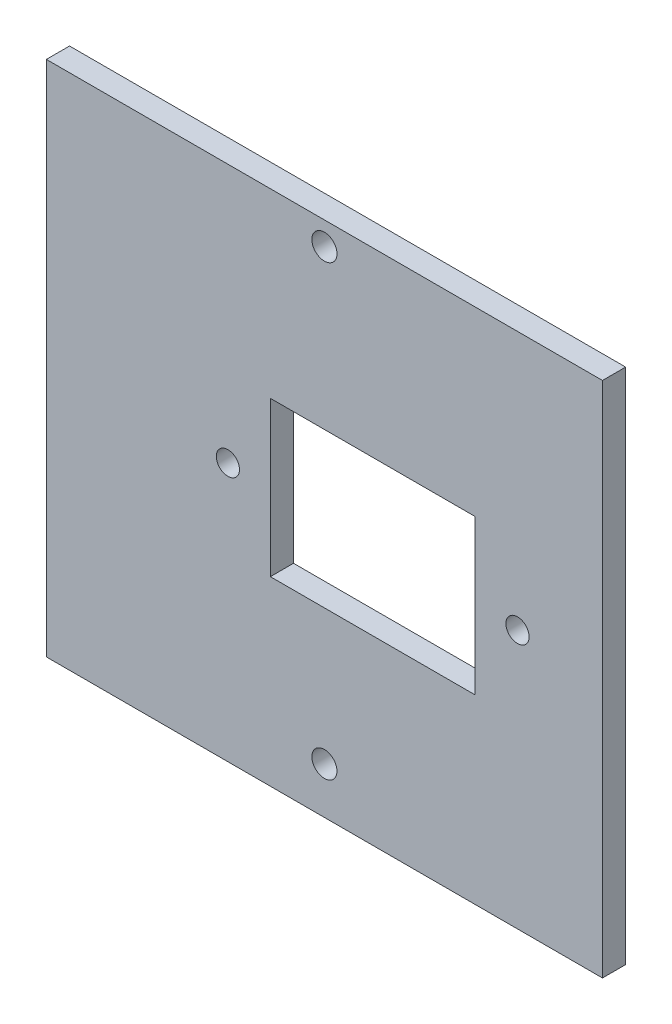
ISO-10303-21;
HEADER;
FILE_DESCRIPTION(('STEP AP214'),'2;1');
FILE_NAME('part.step','',(''),(''),'','','');
FILE_SCHEMA(('AUTOMOTIVE_DESIGN { 1 0 10303 214 1 1 1 1 }'));
ENDSEC;
DATA;
#1=APPLICATION_CONTEXT('core data for automotive mechanical design processes');
#2=APPLICATION_PROTOCOL_DEFINITION('international standard','automotive_design',2000,#1);
#3=PRODUCT_CONTEXT('',#1,'mechanical');
#4=PRODUCT('Part','Part','',(#3));
#5=PRODUCT_RELATED_PRODUCT_CATEGORY('part','',(#4));
#6=PRODUCT_DEFINITION_FORMATION('','',#4);
#7=PRODUCT_DEFINITION_CONTEXT('part definition',#1,'design');
#8=PRODUCT_DEFINITION('design','',#6,#7);
#9=PRODUCT_DEFINITION_SHAPE('','',#8);
#10=(LENGTH_UNIT() NAMED_UNIT(*) SI_UNIT(.MILLI.,.METRE.));
#11=(NAMED_UNIT(*) PLANE_ANGLE_UNIT() SI_UNIT($,.RADIAN.));
#12=(NAMED_UNIT(*) SI_UNIT($,.STERADIAN.) SOLID_ANGLE_UNIT());
#13=UNCERTAINTY_MEASURE_WITH_UNIT(LENGTH_MEASURE(1.E-05),#10,'distance_accuracy_value','');
#14=(GEOMETRIC_REPRESENTATION_CONTEXT(3) GLOBAL_UNCERTAINTY_ASSIGNED_CONTEXT((#13)) GLOBAL_UNIT_ASSIGNED_CONTEXT((#10,
#11,#12)) REPRESENTATION_CONTEXT('',''));
#15=CARTESIAN_POINT('',(0.,0.,0.));
#16=DIRECTION('',(0.,0.,1.));
#17=DIRECTION('',(1.,0.,0.));
#18=AXIS2_PLACEMENT_3D('',#15,#16,#17);
#19=CARTESIAN_POINT('',(119.049688552672,-53.1399541066378,3.));
#20=DIRECTION('',(-1.,0.,0.));
#21=DIRECTION('',(0.,0.,1.));
#22=AXIS2_PLACEMENT_3D('',#19,#20,#21);
#23=PLANE('',#22);
#24=DIRECTION('',(0.,1.,0.));
#25=VECTOR('',#24,1.);
#26=CARTESIAN_POINT('',(119.049688552672,-53.1399541066378,0.));
#27=LINE('',#26,#25);
#28=CARTESIAN_POINT('',(119.049688552672,-53.1399541066378,0.));
#29=VERTEX_POINT('',#28);
#30=CARTESIAN_POINT('',(119.049688552672,13.8600458933622,0.));
#31=VERTEX_POINT('',#30);
#32=EDGE_CURVE('E142',#29,#31,#27,.T.);
#33=ORIENTED_EDGE('',*,*,#32,.T.);
#34=DIRECTION('',(0.,0.,-1.));
#35=VECTOR('',#34,1.);
#36=CARTESIAN_POINT('',(119.049688552672,13.8600458933622,3.));
#37=LINE('',#36,#35);
#38=CARTESIAN_POINT('',(119.049688552672,13.8600458933622,3.));
#39=VERTEX_POINT('',#38);
#40=EDGE_CURVE('E11',#39,#31,#37,.T.);
#41=ORIENTED_EDGE('',*,*,#40,.F.);
#42=DIRECTION('',(0.,1.,0.));
#43=VECTOR('',#42,1.);
#44=CARTESIAN_POINT('',(119.049688552672,-53.1399541066378,3.));
#45=LINE('',#44,#43);
#46=CARTESIAN_POINT('',(119.049688552672,-53.1399541066378,3.));
#47=VERTEX_POINT('',#46);
#48=EDGE_CURVE('E146',#47,#39,#45,.T.);
#49=ORIENTED_EDGE('',*,*,#48,.F.);
#50=DIRECTION('',(0.,0.,-1.));
#51=VECTOR('',#50,1.);
#52=CARTESIAN_POINT('',(119.049688552672,-53.1399541066378,3.));
#53=LINE('',#52,#51);
#54=EDGE_CURVE('E156',#47,#29,#53,.T.);
#55=ORIENTED_EDGE('',*,*,#54,.T.);
#56=EDGE_LOOP('',(#33,#41,#49,#55));
#57=FACE_BOUND('',#56,.T.);
#58=ADVANCED_FACE('F41',(#57),#23,.F.);
#59=CARTESIAN_POINT('',(47.0496885526717,13.8600458933622,3.));
#60=DIRECTION('',(0.,-1.,0.));
#61=DIRECTION('',(0.,0.,-1.));
#62=AXIS2_PLACEMENT_3D('',#59,#60,#61);
#63=PLANE('',#62);
#64=DIRECTION('',(-1.,0.,0.));
#65=VECTOR('',#64,1.);
#66=CARTESIAN_POINT('',(47.0496885526717,13.8600458933622,0.));
#67=LINE('',#66,#65);
#68=CARTESIAN_POINT('',(47.0496885526717,13.8600458933622,0.));
#69=VERTEX_POINT('',#68);
#70=EDGE_CURVE('E159',#31,#69,#67,.T.);
#71=ORIENTED_EDGE('',*,*,#70,.T.);
#72=DIRECTION('',(0.,0.,-1.));
#73=VECTOR('',#72,1.);
#74=CARTESIAN_POINT('',(47.0496885526717,13.8600458933622,3.));
#75=LINE('',#74,#73);
#76=CARTESIAN_POINT('',(47.0496885526717,13.8600458933622,3.));
#77=VERTEX_POINT('',#76);
#78=EDGE_CURVE('E48',#77,#69,#75,.T.);
#79=ORIENTED_EDGE('',*,*,#78,.F.);
#80=DIRECTION('',(-1.,0.,0.));
#81=VECTOR('',#80,1.);
#82=CARTESIAN_POINT('',(47.0496885526717,13.8600458933622,3.));
#83=LINE('',#82,#81);
#84=EDGE_CURVE('E149',#39,#77,#83,.T.);
#85=ORIENTED_EDGE('',*,*,#84,.F.);
#86=ORIENTED_EDGE('',*,*,#40,.T.);
#87=EDGE_LOOP('',(#71,#79,#85,#86));
#88=FACE_BOUND('',#87,.T.);
#89=ADVANCED_FACE('F187',(#88),#63,.F.);
#90=CARTESIAN_POINT('',(47.0496885526717,-53.1399541066378,3.));
#91=DIRECTION('',(1.,0.,0.));
#92=DIRECTION('',(0.,0.,-1.));
#93=AXIS2_PLACEMENT_3D('',#90,#91,#92);
#94=PLANE('',#93);
#95=DIRECTION('',(0.,-1.,0.));
#96=VECTOR('',#95,1.);
#97=CARTESIAN_POINT('',(47.0496885526717,-53.1399541066378,0.));
#98=LINE('',#97,#96);
#99=CARTESIAN_POINT('',(47.0496885526717,-53.1399541066378,0.));
#100=VERTEX_POINT('',#99);
#101=EDGE_CURVE('E161',#69,#100,#98,.T.);
#102=ORIENTED_EDGE('',*,*,#101,.T.);
#103=DIRECTION('',(0.,0.,-1.));
#104=VECTOR('',#103,1.);
#105=CARTESIAN_POINT('',(47.0496885526717,-53.1399541066378,3.));
#106=LINE('',#105,#104);
#107=CARTESIAN_POINT('',(47.0496885526717,-53.1399541066378,3.));
#108=VERTEX_POINT('',#107);
#109=EDGE_CURVE('E166',#108,#100,#106,.T.);
#110=ORIENTED_EDGE('',*,*,#109,.F.);
#111=DIRECTION('',(0.,-1.,0.));
#112=VECTOR('',#111,1.);
#113=CARTESIAN_POINT('',(47.0496885526717,-53.1399541066378,3.));
#114=LINE('',#113,#112);
#115=EDGE_CURVE('E152',#77,#108,#114,.T.);
#116=ORIENTED_EDGE('',*,*,#115,.F.);
#117=ORIENTED_EDGE('',*,*,#78,.T.);
#118=EDGE_LOOP('',(#102,#110,#116,#117));
#119=FACE_BOUND('',#118,.T.);
#120=ADVANCED_FACE('F173',(#119),#94,.F.);
#121=CARTESIAN_POINT('',(47.0496885526717,-53.1399541066378,3.));
#122=DIRECTION('',(0.,1.,0.));
#123=DIRECTION('',(0.,0.,1.));
#124=AXIS2_PLACEMENT_3D('',#121,#122,#123);
#125=PLANE('',#124);
#126=DIRECTION('',(1.,0.,0.));
#127=VECTOR('',#126,1.);
#128=CARTESIAN_POINT('',(47.0496885526717,-53.1399541066378,0.));
#129=LINE('',#128,#127);
#130=EDGE_CURVE('E150',#100,#29,#129,.T.);
#131=ORIENTED_EDGE('',*,*,#130,.T.);
#132=ORIENTED_EDGE('',*,*,#54,.F.);
#133=DIRECTION('',(1.,0.,0.));
#134=VECTOR('',#133,1.);
#135=CARTESIAN_POINT('',(47.0496885526717,-53.1399541066378,3.));
#136=LINE('',#135,#134);
#137=EDGE_CURVE('E154',#108,#47,#136,.T.);
#138=ORIENTED_EDGE('',*,*,#137,.F.);
#139=ORIENTED_EDGE('',*,*,#109,.T.);
#140=EDGE_LOOP('',(#131,#132,#138,#139));
#141=FACE_BOUND('',#140,.T.);
#142=ADVANCED_FACE('F182',(#141),#125,.F.);
#143=CARTESIAN_POINT('',(0.,0.,3.));
#144=DIRECTION('',(0.,0.,-1.));
#145=DIRECTION('',(-1.,0.,0.));
#146=AXIS2_PLACEMENT_3D('',#143,#144,#145);
#147=PLANE('',#146);
#148=CARTESIAN_POINT('',(83.049688552666,-47.1399541066383,3.));
#149=DIRECTION('',(0.,0.,-1.));
#150=DIRECTION('',(-1.,0.,0.));
#151=AXIS2_PLACEMENT_3D('',#148,#149,#150);
#152=CIRCLE('',#151,1.62499999999696);
#153=CARTESIAN_POINT('',(81.424688552669,-47.1399541066383,3.));
#154=VERTEX_POINT('',#153);
#155=EDGE_CURVE('E136',#154,#154,#152,.T.);
#156=ORIENTED_EDGE('',*,*,#155,.T.);
#157=EDGE_LOOP('',(#156));
#158=FACE_BOUND('',#157,.T.);
#159=CARTESIAN_POINT('',(83.049688552666,10.8600458933622,3.));
#160=DIRECTION('',(0.,0.,-1.));
#161=DIRECTION('',(-1.,0.,0.));
#162=AXIS2_PLACEMENT_3D('',#159,#160,#161);
#163=CIRCLE('',#162,1.62499999999459);
#164=CARTESIAN_POINT('',(81.4246885526714,10.8600458933622,3.));
#165=VERTEX_POINT('',#164);
#166=EDGE_CURVE('E252',#165,#165,#163,.T.);
#167=ORIENTED_EDGE('',*,*,#166,.T.);
#168=EDGE_LOOP('',(#167));
#169=FACE_BOUND('',#168,.T.);
#170=CARTESIAN_POINT('',(108.049688552672,-19.6399541066379,3.));
#171=DIRECTION('',(0.,0.,-1.));
#172=DIRECTION('',(-1.,0.,0.));
#173=AXIS2_PLACEMENT_3D('',#170,#171,#172);
#174=CIRCLE('',#173,1.5);
#175=CARTESIAN_POINT('',(106.549688552672,-19.6399541066379,3.));
#176=VERTEX_POINT('',#175);
#177=EDGE_CURVE('E234',#176,#176,#174,.T.);
#178=ORIENTED_EDGE('',*,*,#177,.T.);
#179=EDGE_LOOP('',(#178));
#180=FACE_BOUND('',#179,.T.);
#181=CARTESIAN_POINT('',(70.5496885526717,-19.6399541066379,3.));
#182=DIRECTION('',(0.,0.,-1.));
#183=DIRECTION('',(-1.,0.,0.));
#184=AXIS2_PLACEMENT_3D('',#181,#182,#183);
#185=CIRCLE('',#184,1.5);
#186=CARTESIAN_POINT('',(69.0496885526717,-19.6399541066379,3.));
#187=VERTEX_POINT('',#186);
#188=EDGE_CURVE('E239',#187,#187,#185,.T.);
#189=ORIENTED_EDGE('',*,*,#188,.T.);
#190=EDGE_LOOP('',(#189));
#191=FACE_BOUND('',#190,.T.);
#192=DIRECTION('',(0.,1.,0.));
#193=VECTOR('',#192,1.);
#194=CARTESIAN_POINT('',(76.0496885526717,-9.63995410663785,3.));
#195=LINE('',#194,#193);
#196=CARTESIAN_POINT('',(76.0496885526717,-29.6399541066378,3.));
#197=VERTEX_POINT('',#196);
#198=CARTESIAN_POINT('',(76.0496885526717,-9.63995410663785,3.));
#199=VERTEX_POINT('',#198);
#200=EDGE_CURVE('E113',#197,#199,#195,.T.);
#201=ORIENTED_EDGE('',*,*,#200,.T.);
#202=DIRECTION('',(1.,0.,0.));
#203=VECTOR('',#202,1.);
#204=CARTESIAN_POINT('',(102.549688552672,-9.63995410663785,3.));
#205=LINE('',#204,#203);
#206=CARTESIAN_POINT('',(102.549688552672,-9.63995410663785,3.));
#207=VERTEX_POINT('',#206);
#208=EDGE_CURVE('E107',#199,#207,#205,.T.);
#209=ORIENTED_EDGE('',*,*,#208,.T.);
#210=DIRECTION('',(0.,-1.,0.));
#211=VECTOR('',#210,1.);
#212=CARTESIAN_POINT('',(102.549688552672,-9.63995410663785,3.));
#213=LINE('',#212,#211);
#214=CARTESIAN_POINT('',(102.549688552672,-29.6399541066379,3.));
#215=VERTEX_POINT('',#214);
#216=EDGE_CURVE('E116',#207,#215,#213,.T.);
#217=ORIENTED_EDGE('',*,*,#216,.T.);
#218=DIRECTION('',(-1.,0.,0.));
#219=VECTOR('',#218,1.);
#220=CARTESIAN_POINT('',(76.0496885526717,-29.6399541066378,3.));
#221=LINE('',#220,#219);
#222=EDGE_CURVE('E55',#215,#197,#221,.T.);
#223=ORIENTED_EDGE('',*,*,#222,.T.);
#224=EDGE_LOOP('',(#201,#209,#217,#223));
#225=FACE_BOUND('',#224,.T.);
#226=ORIENTED_EDGE('',*,*,#48,.T.);
#227=ORIENTED_EDGE('',*,*,#84,.T.);
#228=ORIENTED_EDGE('',*,*,#115,.T.);
#229=ORIENTED_EDGE('',*,*,#137,.T.);
#230=EDGE_LOOP('',(#226,#227,#228,#229));
#231=FACE_BOUND('',#230,.T.);
#232=ADVANCED_FACE('F120',(#158,#169,#180,#191,#225,#231),#147,.F.);
#233=CARTESIAN_POINT('',(0.,0.,0.));
#234=DIRECTION('',(0.,0.,-1.));
#235=DIRECTION('',(-1.,0.,0.));
#236=AXIS2_PLACEMENT_3D('',#233,#234,#235);
#237=PLANE('',#236);
#238=CARTESIAN_POINT('',(83.049688552666,-47.1399541066383,0.));
#239=DIRECTION('',(0.,0.,-1.));
#240=DIRECTION('',(-1.,0.,0.));
#241=AXIS2_PLACEMENT_3D('',#238,#239,#240);
#242=CIRCLE('',#241,1.62499999999696);
#243=CARTESIAN_POINT('',(81.424688552669,-47.1399541066383,0.));
#244=VERTEX_POINT('',#243);
#245=EDGE_CURVE('E250',#244,#244,#242,.T.);
#246=ORIENTED_EDGE('',*,*,#245,.F.);
#247=EDGE_LOOP('',(#246));
#248=FACE_BOUND('',#247,.T.);
#249=CARTESIAN_POINT('',(83.049688552666,10.8600458933622,0.));
#250=DIRECTION('',(0.,0.,-1.));
#251=DIRECTION('',(-1.,0.,0.));
#252=AXIS2_PLACEMENT_3D('',#249,#250,#251);
#253=CIRCLE('',#252,1.62499999999459);
#254=CARTESIAN_POINT('',(81.4246885526714,10.8600458933622,0.));
#255=VERTEX_POINT('',#254);
#256=EDGE_CURVE('E129',#255,#255,#253,.T.);
#257=ORIENTED_EDGE('',*,*,#256,.F.);
#258=EDGE_LOOP('',(#257));
#259=FACE_BOUND('',#258,.T.);
#260=CARTESIAN_POINT('',(108.049688552672,-19.6399541066379,0.));
#261=DIRECTION('',(0.,0.,-1.));
#262=DIRECTION('',(-1.,0.,0.));
#263=AXIS2_PLACEMENT_3D('',#260,#261,#262);
#264=CIRCLE('',#263,1.5);
#265=CARTESIAN_POINT('',(106.549688552672,-19.6399541066379,0.));
#266=VERTEX_POINT('',#265);
#267=EDGE_CURVE('E237',#266,#266,#264,.T.);
#268=ORIENTED_EDGE('',*,*,#267,.F.);
#269=EDGE_LOOP('',(#268));
#270=FACE_BOUND('',#269,.T.);
#271=CARTESIAN_POINT('',(70.5496885526717,-19.6399541066379,0.));
#272=DIRECTION('',(0.,0.,-1.));
#273=DIRECTION('',(-1.,0.,0.));
#274=AXIS2_PLACEMENT_3D('',#271,#272,#273);
#275=CIRCLE('',#274,1.5);
#276=CARTESIAN_POINT('',(69.0496885526717,-19.6399541066379,0.));
#277=VERTEX_POINT('',#276);
#278=EDGE_CURVE('E243',#277,#277,#275,.T.);
#279=ORIENTED_EDGE('',*,*,#278,.F.);
#280=EDGE_LOOP('',(#279));
#281=FACE_BOUND('',#280,.T.);
#282=DIRECTION('',(1.,0.,0.));
#283=VECTOR('',#282,1.);
#284=CARTESIAN_POINT('',(102.549688552672,-9.63995410663785,0.));
#285=LINE('',#284,#283);
#286=CARTESIAN_POINT('',(76.0496885526717,-9.63995410663785,0.));
#287=VERTEX_POINT('',#286);
#288=CARTESIAN_POINT('',(102.549688552672,-9.63995410663785,0.));
#289=VERTEX_POINT('',#288);
#290=EDGE_CURVE('E63',#287,#289,#285,.T.);
#291=ORIENTED_EDGE('',*,*,#290,.F.);
#292=DIRECTION('',(0.,1.,0.));
#293=VECTOR('',#292,1.);
#294=CARTESIAN_POINT('',(76.0496885526717,-9.63995410663785,0.));
#295=LINE('',#294,#293);
#296=CARTESIAN_POINT('',(76.0496885526717,-29.6399541066378,0.));
#297=VERTEX_POINT('',#296);
#298=EDGE_CURVE('E123',#297,#287,#295,.T.);
#299=ORIENTED_EDGE('',*,*,#298,.F.);
#300=DIRECTION('',(-1.,0.,0.));
#301=VECTOR('',#300,1.);
#302=CARTESIAN_POINT('',(76.0496885526717,-29.6399541066378,0.));
#303=LINE('',#302,#301);
#304=CARTESIAN_POINT('',(102.549688552672,-29.6399541066379,0.));
#305=VERTEX_POINT('',#304);
#306=EDGE_CURVE('E126',#305,#297,#303,.T.);
#307=ORIENTED_EDGE('',*,*,#306,.F.);
#308=DIRECTION('',(0.,-1.,0.));
#309=VECTOR('',#308,1.);
#310=CARTESIAN_POINT('',(102.549688552672,-9.63995410663785,0.));
#311=LINE('',#310,#309);
#312=EDGE_CURVE('E135',#289,#305,#311,.T.);
#313=ORIENTED_EDGE('',*,*,#312,.F.);
#314=EDGE_LOOP('',(#291,#299,#307,#313));
#315=FACE_BOUND('',#314,.T.);
#316=ORIENTED_EDGE('',*,*,#32,.F.);
#317=ORIENTED_EDGE('',*,*,#130,.F.);
#318=ORIENTED_EDGE('',*,*,#101,.F.);
#319=ORIENTED_EDGE('',*,*,#70,.F.);
#320=EDGE_LOOP('',(#316,#317,#318,#319));
#321=FACE_BOUND('',#320,.T.);
#322=ADVANCED_FACE('F179',(#248,#259,#270,#281,#315,#321),#237,.T.);
#323=CARTESIAN_POINT('',(102.549688552672,-9.63995410663785,3.));
#324=DIRECTION('',(0.,1.,0.));
#325=DIRECTION('',(0.,0.,1.));
#326=AXIS2_PLACEMENT_3D('',#323,#324,#325);
#327=PLANE('',#326);
#328=ORIENTED_EDGE('',*,*,#290,.T.);
#329=DIRECTION('',(0.,0.,-1.));
#330=VECTOR('',#329,1.);
#331=CARTESIAN_POINT('',(102.549688552672,-9.63995410663785,3.));
#332=LINE('',#331,#330);
#333=EDGE_CURVE('E103',#207,#289,#332,.T.);
#334=ORIENTED_EDGE('',*,*,#333,.F.);
#335=ORIENTED_EDGE('',*,*,#208,.F.);
#336=DIRECTION('',(0.,0.,-1.));
#337=VECTOR('',#336,1.);
#338=CARTESIAN_POINT('',(76.0496885526717,-9.63995410663785,3.));
#339=LINE('',#338,#337);
#340=EDGE_CURVE('E140',#199,#287,#339,.T.);
#341=ORIENTED_EDGE('',*,*,#340,.T.);
#342=EDGE_LOOP('',(#328,#334,#335,#341));
#343=FACE_BOUND('',#342,.T.);
#344=ADVANCED_FACE('F105',(#343),#327,.F.);
#345=CARTESIAN_POINT('',(76.0496885526717,-9.63995410663785,3.));
#346=DIRECTION('',(-1.,0.,0.));
#347=DIRECTION('',(0.,0.,1.));
#348=AXIS2_PLACEMENT_3D('',#345,#346,#347);
#349=PLANE('',#348);
#350=ORIENTED_EDGE('',*,*,#298,.T.);
#351=ORIENTED_EDGE('',*,*,#340,.F.);
#352=ORIENTED_EDGE('',*,*,#200,.F.);
#353=DIRECTION('',(0.,0.,-1.));
#354=VECTOR('',#353,1.);
#355=CARTESIAN_POINT('',(76.0496885526717,-29.6399541066378,3.));
#356=LINE('',#355,#354);
#357=EDGE_CURVE('E143',#197,#297,#356,.T.);
#358=ORIENTED_EDGE('',*,*,#357,.T.);
#359=EDGE_LOOP('',(#350,#351,#352,#358));
#360=FACE_BOUND('',#359,.T.);
#361=ADVANCED_FACE('F205',(#360),#349,.F.);
#362=CARTESIAN_POINT('',(76.0496885526717,-29.6399541066378,3.));
#363=DIRECTION('',(0.,-1.,0.));
#364=DIRECTION('',(1.,0.,0.));
#365=AXIS2_PLACEMENT_3D('',#362,#363,#364);
#366=PLANE('',#365);
#367=ORIENTED_EDGE('',*,*,#306,.T.);
#368=ORIENTED_EDGE('',*,*,#357,.F.);
#369=ORIENTED_EDGE('',*,*,#222,.F.);
#370=DIRECTION('',(0.,0.,-1.));
#371=VECTOR('',#370,1.);
#372=CARTESIAN_POINT('',(102.549688552672,-29.6399541066379,3.));
#373=LINE('',#372,#371);
#374=EDGE_CURVE('E112',#215,#305,#373,.T.);
#375=ORIENTED_EDGE('',*,*,#374,.T.);
#376=EDGE_LOOP('',(#367,#368,#369,#375));
#377=FACE_BOUND('',#376,.T.);
#378=ADVANCED_FACE('F209',(#377),#366,.F.);
#379=CARTESIAN_POINT('',(102.549688552672,-9.63995410663785,3.));
#380=DIRECTION('',(1.,0.,0.));
#381=DIRECTION('',(0.,0.,-1.));
#382=AXIS2_PLACEMENT_3D('',#379,#380,#381);
#383=PLANE('',#382);
#384=ORIENTED_EDGE('',*,*,#312,.T.);
#385=ORIENTED_EDGE('',*,*,#374,.F.);
#386=ORIENTED_EDGE('',*,*,#216,.F.);
#387=ORIENTED_EDGE('',*,*,#333,.T.);
#388=EDGE_LOOP('',(#384,#385,#386,#387));
#389=FACE_BOUND('',#388,.T.);
#390=ADVANCED_FACE('F117',(#389),#383,.F.);
#391=CARTESIAN_POINT('',(70.5496885526717,-19.6399541066379,3.));
#392=DIRECTION('',(0.,0.,-1.));
#393=DIRECTION('',(-1.,0.,0.));
#394=AXIS2_PLACEMENT_3D('',#391,#392,#393);
#395=CYLINDRICAL_SURFACE('',#394,1.5);
#396=ORIENTED_EDGE('',*,*,#188,.F.);
#397=EDGE_LOOP('',(#396));
#398=FACE_BOUND('',#397,.T.);
#399=ORIENTED_EDGE('',*,*,#278,.T.);
#400=EDGE_LOOP('',(#399));
#401=FACE_BOUND('',#400,.T.);
#402=ADVANCED_FACE('F208',(#398,#401),#395,.F.);
#403=CARTESIAN_POINT('',(108.049688552672,-19.6399541066379,3.));
#404=DIRECTION('',(0.,0.,-1.));
#405=DIRECTION('',(-1.,0.,0.));
#406=AXIS2_PLACEMENT_3D('',#403,#404,#405);
#407=CYLINDRICAL_SURFACE('',#406,1.5);
#408=ORIENTED_EDGE('',*,*,#177,.F.);
#409=EDGE_LOOP('',(#408));
#410=FACE_BOUND('',#409,.T.);
#411=ORIENTED_EDGE('',*,*,#267,.T.);
#412=EDGE_LOOP('',(#411));
#413=FACE_BOUND('',#412,.T.);
#414=ADVANCED_FACE('F219',(#410,#413),#407,.F.);
#415=CARTESIAN_POINT('',(83.049688552666,10.8600458933622,3.));
#416=DIRECTION('',(0.,0.,-1.));
#417=DIRECTION('',(-1.,0.,0.));
#418=AXIS2_PLACEMENT_3D('',#415,#416,#417);
#419=CYLINDRICAL_SURFACE('',#418,1.62499999999459);
#420=ORIENTED_EDGE('',*,*,#166,.F.);
#421=EDGE_LOOP('',(#420));
#422=FACE_BOUND('',#421,.T.);
#423=ORIENTED_EDGE('',*,*,#256,.T.);
#424=EDGE_LOOP('',(#423));
#425=FACE_BOUND('',#424,.T.);
#426=ADVANCED_FACE('F215',(#422,#425),#419,.F.);
#427=CARTESIAN_POINT('',(83.049688552666,-47.1399541066383,3.));
#428=DIRECTION('',(0.,0.,-1.));
#429=DIRECTION('',(-1.,0.,0.));
#430=AXIS2_PLACEMENT_3D('',#427,#428,#429);
#431=CYLINDRICAL_SURFACE('',#430,1.62499999999696);
#432=ORIENTED_EDGE('',*,*,#155,.F.);
#433=EDGE_LOOP('',(#432));
#434=FACE_BOUND('',#433,.T.);
#435=ORIENTED_EDGE('',*,*,#245,.T.);
#436=EDGE_LOOP('',(#435));
#437=FACE_BOUND('',#436,.T.);
#438=ADVANCED_FACE('F218',(#434,#437),#431,.F.);
#439=CLOSED_SHELL('',(#58,#89,#120,#142,#232,#322,#344,#361,#378,#390,#402,#414,#426,#438));
#440=MANIFOLD_SOLID_BREP('B2',#439);
#441=ADVANCED_BREP_SHAPE_REPRESENTATION('',(#18,#440),#14);
#442=SHAPE_DEFINITION_REPRESENTATION(#9,#441);
ENDSEC;
END-ISO-10303-21;
